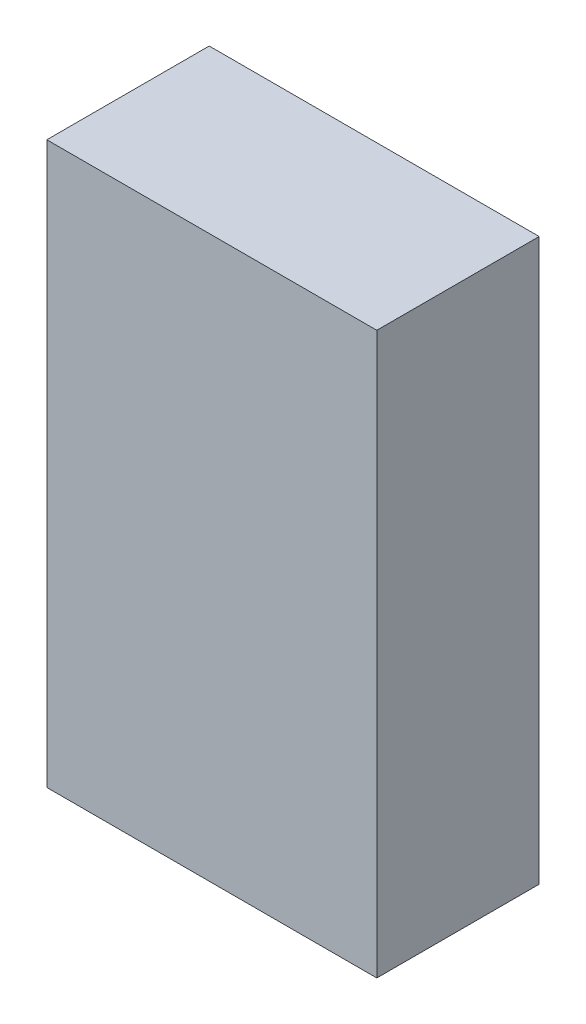
ISO-10303-21;
HEADER;
FILE_DESCRIPTION(('STEP AP214'),'2;1');
FILE_NAME('part.step','',(''),(''),'','','');
FILE_SCHEMA(('AUTOMOTIVE_DESIGN { 1 0 10303 214 1 1 1 1 }'));
ENDSEC;
DATA;
#1=APPLICATION_CONTEXT('core data for automotive mechanical design processes');
#2=APPLICATION_PROTOCOL_DEFINITION('international standard','automotive_design',2000,#1);
#3=PRODUCT_CONTEXT('',#1,'mechanical');
#4=PRODUCT('Part','Part','',(#3));
#5=PRODUCT_RELATED_PRODUCT_CATEGORY('part','',(#4));
#6=PRODUCT_DEFINITION_FORMATION('','',#4);
#7=PRODUCT_DEFINITION_CONTEXT('part definition',#1,'design');
#8=PRODUCT_DEFINITION('design','',#6,#7);
#9=PRODUCT_DEFINITION_SHAPE('','',#8);
#10=(LENGTH_UNIT() NAMED_UNIT(*) SI_UNIT(.MILLI.,.METRE.));
#11=(NAMED_UNIT(*) PLANE_ANGLE_UNIT() SI_UNIT($,.RADIAN.));
#12=(NAMED_UNIT(*) SI_UNIT($,.STERADIAN.) SOLID_ANGLE_UNIT());
#13=UNCERTAINTY_MEASURE_WITH_UNIT(LENGTH_MEASURE(1.E-05),#10,'distance_accuracy_value','');
#14=(GEOMETRIC_REPRESENTATION_CONTEXT(3) GLOBAL_UNCERTAINTY_ASSIGNED_CONTEXT((#13)) GLOBAL_UNIT_ASSIGNED_CONTEXT((#10,
#11,#12)) REPRESENTATION_CONTEXT('',''));
#15=CARTESIAN_POINT('',(0.,0.,0.));
#16=DIRECTION('',(0.,0.,1.));
#17=DIRECTION('',(1.,0.,0.));
#18=AXIS2_PLACEMENT_3D('',#15,#16,#17);
#19=CARTESIAN_POINT('',(0.254,0.4318,0.2499995));
#20=DIRECTION('',(0.,0.,-1.));
#21=DIRECTION('',(-1.,0.,0.));
#22=AXIS2_PLACEMENT_3D('',#19,#20,#21);
#23=PLANE('',#22);
#24=DIRECTION('',(0.,1.,0.));
#25=VECTOR('',#24,1.);
#26=CARTESIAN_POINT('',(-0.254,0.4318,0.2499995));
#27=LINE('',#26,#25);
#28=CARTESIAN_POINT('',(-0.254,0.4318,0.2499995));
#29=VERTEX_POINT('',#28);
#30=CARTESIAN_POINT('',(-0.254,-0.4318,0.2499995));
#31=VERTEX_POINT('',#30);
#32=EDGE_CURVE('E55',#29,#31,#27,.F.);
#33=ORIENTED_EDGE('',*,*,#32,.T.);
#34=DIRECTION('',(1.,0.,0.));
#35=VECTOR('',#34,1.);
#36=CARTESIAN_POINT('',(-0.254,-0.4318,0.2499995));
#37=LINE('',#36,#35);
#38=CARTESIAN_POINT('',(0.254,-0.4318,0.2499995));
#39=VERTEX_POINT('',#38);
#40=EDGE_CURVE('E57',#31,#39,#37,.T.);
#41=ORIENTED_EDGE('',*,*,#40,.T.);
#42=DIRECTION('',(0.,1.,0.));
#43=VECTOR('',#42,1.);
#44=CARTESIAN_POINT('',(0.254,-0.4318,0.2499995));
#45=LINE('',#44,#43);
#46=CARTESIAN_POINT('',(0.254,0.4318,0.2499995));
#47=VERTEX_POINT('',#46);
#48=EDGE_CURVE('E20',#39,#47,#45,.T.);
#49=ORIENTED_EDGE('',*,*,#48,.T.);
#50=DIRECTION('',(1.,0.,0.));
#51=VECTOR('',#50,1.);
#52=CARTESIAN_POINT('',(0.254,0.4318,0.2499995));
#53=LINE('',#52,#51);
#54=EDGE_CURVE('E80',#47,#29,#53,.F.);
#55=ORIENTED_EDGE('',*,*,#54,.T.);
#56=EDGE_LOOP('',(#33,#41,#49,#55));
#57=FACE_BOUND('',#56,.T.);
#58=ADVANCED_FACE('F17',(#57),#23,.F.);
#59=CARTESIAN_POINT('',(0.254,-0.4318,0.));
#60=DIRECTION('',(-1.,0.,0.));
#61=DIRECTION('',(0.,0.,1.));
#62=AXIS2_PLACEMENT_3D('',#59,#60,#61);
#63=PLANE('',#62);
#64=DIRECTION('',(0.,0.,-1.));
#65=VECTOR('',#64,1.);
#66=CARTESIAN_POINT('',(0.254,0.4318,0.));
#67=LINE('',#66,#65);
#68=CARTESIAN_POINT('',(0.254,0.4318,0.));
#69=VERTEX_POINT('',#68);
#70=EDGE_CURVE('E68',#69,#47,#67,.F.);
#71=ORIENTED_EDGE('',*,*,#70,.T.);
#72=ORIENTED_EDGE('',*,*,#48,.F.);
#73=DIRECTION('',(0.,0.,1.));
#74=VECTOR('',#73,1.);
#75=CARTESIAN_POINT('',(0.254,-0.4318,0.));
#76=LINE('',#75,#74);
#77=CARTESIAN_POINT('',(0.254,-0.4318,0.));
#78=VERTEX_POINT('',#77);
#79=EDGE_CURVE('E63',#39,#78,#76,.F.);
#80=ORIENTED_EDGE('',*,*,#79,.T.);
#81=DIRECTION('',(0.,1.,0.));
#82=VECTOR('',#81,1.);
#83=CARTESIAN_POINT('',(0.254,0.4318,0.));
#84=LINE('',#83,#82);
#85=EDGE_CURVE('E83',#69,#78,#84,.F.);
#86=ORIENTED_EDGE('',*,*,#85,.F.);
#87=EDGE_LOOP('',(#71,#72,#80,#86));
#88=FACE_BOUND('',#87,.T.);
#89=ADVANCED_FACE('F65',(#88),#63,.F.);
#90=CARTESIAN_POINT('',(-0.254,-0.4318,0.));
#91=DIRECTION('',(0.,1.,0.));
#92=DIRECTION('',(0.,0.,1.));
#93=AXIS2_PLACEMENT_3D('',#90,#91,#92);
#94=PLANE('',#93);
#95=ORIENTED_EDGE('',*,*,#79,.F.);
#96=ORIENTED_EDGE('',*,*,#40,.F.);
#97=DIRECTION('',(0.,0.,-1.));
#98=VECTOR('',#97,1.);
#99=CARTESIAN_POINT('',(-0.254,-0.4318,0.));
#100=LINE('',#99,#98);
#101=CARTESIAN_POINT('',(-0.254,-0.4318,0.));
#102=VERTEX_POINT('',#101);
#103=EDGE_CURVE('E75',#31,#102,#100,.T.);
#104=ORIENTED_EDGE('',*,*,#103,.T.);
#105=DIRECTION('',(-1.,0.,0.));
#106=VECTOR('',#105,1.);
#107=CARTESIAN_POINT('',(0.254,-0.4318,0.));
#108=LINE('',#107,#106);
#109=EDGE_CURVE('E72',#78,#102,#108,.T.);
#110=ORIENTED_EDGE('',*,*,#109,.F.);
#111=EDGE_LOOP('',(#95,#96,#104,#110));
#112=FACE_BOUND('',#111,.T.);
#113=ADVANCED_FACE('F70',(#112),#94,.F.);
#114=CARTESIAN_POINT('',(-0.254,0.4318,0.));
#115=DIRECTION('',(1.,0.,0.));
#116=DIRECTION('',(0.,0.,-1.));
#117=AXIS2_PLACEMENT_3D('',#114,#115,#116);
#118=PLANE('',#117);
#119=ORIENTED_EDGE('',*,*,#103,.F.);
#120=ORIENTED_EDGE('',*,*,#32,.F.);
#121=DIRECTION('',(0.,0.,-1.));
#122=VECTOR('',#121,1.);
#123=CARTESIAN_POINT('',(-0.254,0.4318,0.));
#124=LINE('',#123,#122);
#125=CARTESIAN_POINT('',(-0.254,0.4318,0.));
#126=VERTEX_POINT('',#125);
#127=EDGE_CURVE('E35',#29,#126,#124,.T.);
#128=ORIENTED_EDGE('',*,*,#127,.T.);
#129=DIRECTION('',(0.,1.,0.));
#130=VECTOR('',#129,1.);
#131=CARTESIAN_POINT('',(-0.254,0.4318,0.));
#132=LINE('',#131,#130);
#133=EDGE_CURVE('E26',#102,#126,#132,.T.);
#134=ORIENTED_EDGE('',*,*,#133,.F.);
#135=EDGE_LOOP('',(#119,#120,#128,#134));
#136=FACE_BOUND('',#135,.T.);
#137=ADVANCED_FACE('F89',(#136),#118,.F.);
#138=CARTESIAN_POINT('',(0.254,0.4318,0.));
#139=DIRECTION('',(0.,-1.,0.));
#140=DIRECTION('',(0.,0.,-1.));
#141=AXIS2_PLACEMENT_3D('',#138,#139,#140);
#142=PLANE('',#141);
#143=ORIENTED_EDGE('',*,*,#127,.F.);
#144=ORIENTED_EDGE('',*,*,#54,.F.);
#145=ORIENTED_EDGE('',*,*,#70,.F.);
#146=DIRECTION('',(-1.,0.,0.));
#147=VECTOR('',#146,1.);
#148=CARTESIAN_POINT('',(0.254,0.4318,0.));
#149=LINE('',#148,#147);
#150=EDGE_CURVE('E11',#126,#69,#149,.F.);
#151=ORIENTED_EDGE('',*,*,#150,.F.);
#152=EDGE_LOOP('',(#143,#144,#145,#151));
#153=FACE_BOUND('',#152,.T.);
#154=ADVANCED_FACE('F91',(#153),#142,.F.);
#155=CARTESIAN_POINT('',(0.254,0.4318,0.));
#156=DIRECTION('',(0.,0.,-1.));
#157=DIRECTION('',(-1.,0.,0.));
#158=AXIS2_PLACEMENT_3D('',#155,#156,#157);
#159=PLANE('',#158);
#160=ORIENTED_EDGE('',*,*,#133,.T.);
#161=ORIENTED_EDGE('',*,*,#150,.T.);
#162=ORIENTED_EDGE('',*,*,#85,.T.);
#163=ORIENTED_EDGE('',*,*,#109,.T.);
#164=EDGE_LOOP('',(#160,#161,#162,#163));
#165=FACE_BOUND('',#164,.T.);
#166=ADVANCED_FACE('F88',(#165),#159,.T.);
#167=CLOSED_SHELL('',(#58,#89,#113,#137,#154,#166));
#168=MANIFOLD_SOLID_BREP('B1',#167);
#169=ADVANCED_BREP_SHAPE_REPRESENTATION('',(#18,#168),#14);
#170=SHAPE_DEFINITION_REPRESENTATION(#9,#169);
ENDSEC;
END-ISO-10303-21;
